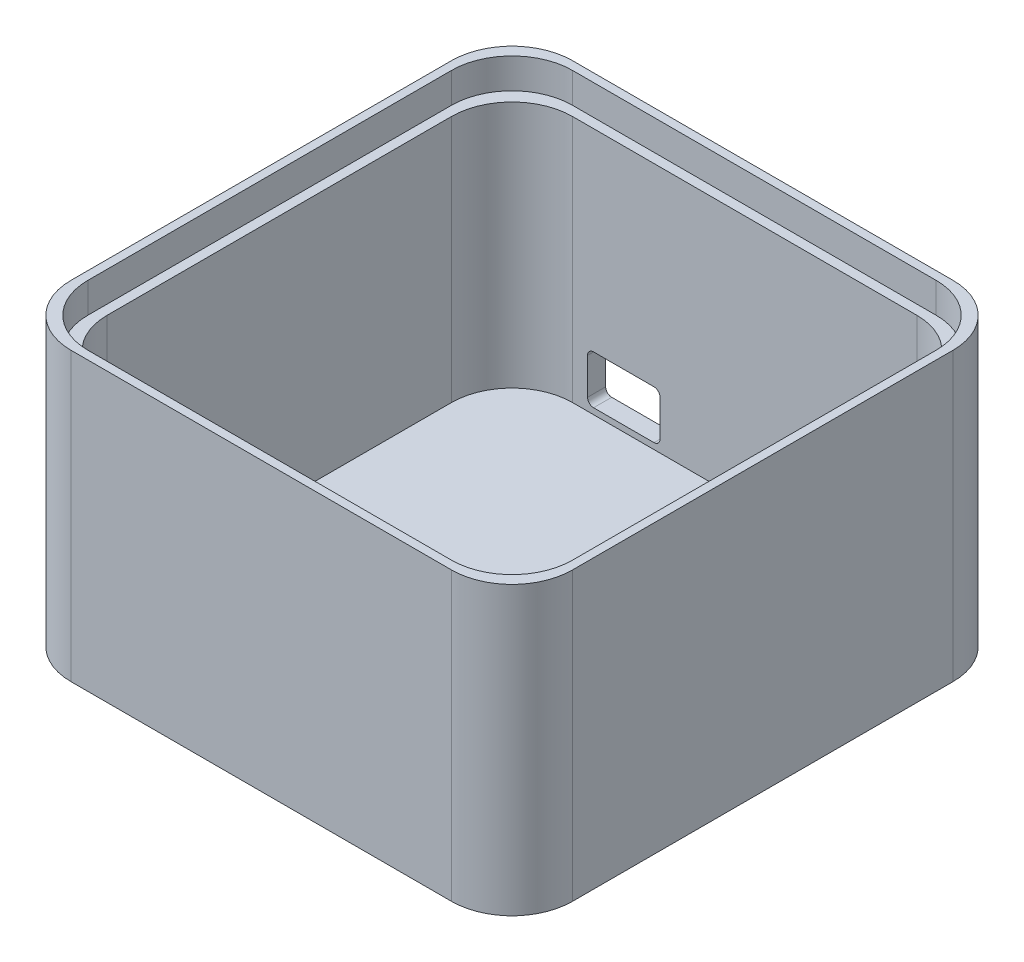
ISO-10303-21;
HEADER;
FILE_DESCRIPTION(('STEP AP214'),'2;1');
FILE_NAME('part.step','',(''),(''),'','','');
FILE_SCHEMA(('AUTOMOTIVE_DESIGN { 1 0 10303 214 1 1 1 1 }'));
ENDSEC;
DATA;
#1=APPLICATION_CONTEXT('core data for automotive mechanical design processes');
#2=APPLICATION_PROTOCOL_DEFINITION('international standard','automotive_design',2000,#1);
#3=PRODUCT_CONTEXT('',#1,'mechanical');
#4=PRODUCT('Part','Part','',(#3));
#5=PRODUCT_RELATED_PRODUCT_CATEGORY('part','',(#4));
#6=PRODUCT_DEFINITION_FORMATION('','',#4);
#7=PRODUCT_DEFINITION_CONTEXT('part definition',#1,'design');
#8=PRODUCT_DEFINITION('design','',#6,#7);
#9=PRODUCT_DEFINITION_SHAPE('','',#8);
#10=(LENGTH_UNIT() NAMED_UNIT(*) SI_UNIT(.MILLI.,.METRE.));
#11=(NAMED_UNIT(*) PLANE_ANGLE_UNIT() SI_UNIT($,.RADIAN.));
#12=(NAMED_UNIT(*) SI_UNIT($,.STERADIAN.) SOLID_ANGLE_UNIT());
#13=UNCERTAINTY_MEASURE_WITH_UNIT(LENGTH_MEASURE(1.E-05),#10,'distance_accuracy_value','');
#14=(GEOMETRIC_REPRESENTATION_CONTEXT(3) GLOBAL_UNCERTAINTY_ASSIGNED_CONTEXT((#13)) GLOBAL_UNIT_ASSIGNED_CONTEXT((#10,
#11,#12)) REPRESENTATION_CONTEXT('',''));
#15=CARTESIAN_POINT('',(0.,0.,0.));
#16=DIRECTION('',(0.,0.,1.));
#17=DIRECTION('',(1.,0.,0.));
#18=AXIS2_PLACEMENT_3D('',#15,#16,#17);
#19=CARTESIAN_POINT('',(-28.4999999999999,46.,-38.5));
#20=DIRECTION('',(0.,0.,-1.));
#21=DIRECTION('',(-1.,0.,0.));
#22=AXIS2_PLACEMENT_3D('',#19,#20,#21);
#23=PLANE('',#22);
#24=CARTESIAN_POINT('',(20.,5.,-38.5));
#25=DIRECTION('',(0.,0.,-1.));
#26=DIRECTION('',(-1.,0.,0.));
#27=AXIS2_PLACEMENT_3D('',#24,#25,#26);
#28=CIRCLE('',#27,3.);
#29=CARTESIAN_POINT('',(17.,5.,-38.5));
#30=VERTEX_POINT('',#29);
#31=EDGE_CURVE('E387',#30,#30,#28,.T.);
#32=ORIENTED_EDGE('',*,*,#31,.T.);
#33=EDGE_LOOP('',(#32));
#34=FACE_BOUND('',#33,.T.);
#35=DIRECTION('',(1.,0.,0.));
#36=VECTOR('',#35,1.);
#37=CARTESIAN_POINT('',(-28.4999999999999,41.,-38.5));
#38=LINE('',#37,#36);
#39=CARTESIAN_POINT('',(-28.4999999999999,41.,-38.5));
#40=VERTEX_POINT('',#39);
#41=CARTESIAN_POINT('',(28.4999999999999,41.,-38.5));
#42=VERTEX_POINT('',#41);
#43=EDGE_CURVE('E12',#40,#42,#38,.T.);
#44=ORIENTED_EDGE('',*,*,#43,.F.);
#45=DIRECTION('',(0.,-1.,0.));
#46=VECTOR('',#45,1.);
#47=CARTESIAN_POINT('',(-28.4999999999999,46.,-38.5));
#48=LINE('',#47,#46);
#49=CARTESIAN_POINT('',(-28.4999999999999,0.,-38.5));
#50=VERTEX_POINT('',#49);
#51=EDGE_CURVE('E564',#40,#50,#48,.T.);
#52=ORIENTED_EDGE('',*,*,#51,.T.);
#53=DIRECTION('',(1.,0.,0.));
#54=VECTOR('',#53,1.);
#55=CARTESIAN_POINT('',(-28.4999999999999,0.,-38.5));
#56=LINE('',#55,#54);
#57=CARTESIAN_POINT('',(28.4999999999999,0.,-38.5));
#58=VERTEX_POINT('',#57);
#59=EDGE_CURVE('E560',#50,#58,#56,.T.);
#60=ORIENTED_EDGE('',*,*,#59,.T.);
#61=DIRECTION('',(0.,-1.,0.));
#62=VECTOR('',#61,1.);
#63=CARTESIAN_POINT('',(28.4999999999999,46.,-38.5));
#64=LINE('',#63,#62);
#65=EDGE_CURVE('E568',#42,#58,#64,.T.);
#66=ORIENTED_EDGE('',*,*,#65,.F.);
#67=EDGE_LOOP('',(#44,#52,#60,#66));
#68=FACE_BOUND('',#67,.T.);
#69=CARTESIAN_POINT('',(-15.,8.,-38.5));
#70=DIRECTION('',(0.,0.,-1.));
#71=DIRECTION('',(-1.,0.,0.));
#72=AXIS2_PLACEMENT_3D('',#69,#70,#71);
#73=CIRCLE('',#72,1.);
#74=CARTESIAN_POINT('',(-14.,7.99999999999999,-38.5));
#75=VERTEX_POINT('',#74);
#76=CARTESIAN_POINT('',(-15.,9.,-38.5));
#77=VERTEX_POINT('',#76);
#78=EDGE_CURVE('E384',#75,#77,#73,.F.);
#79=ORIENTED_EDGE('',*,*,#78,.F.);
#80=DIRECTION('',(0.,1.,0.));
#81=VECTOR('',#80,1.);
#82=CARTESIAN_POINT('',(-14.,46.,-38.5));
#83=LINE('',#82,#81);
#84=CARTESIAN_POINT('',(-14.,2.00000000000001,-38.5));
#85=VERTEX_POINT('',#84);
#86=EDGE_CURVE('E361',#85,#75,#83,.T.);
#87=ORIENTED_EDGE('',*,*,#86,.F.);
#88=CARTESIAN_POINT('',(-15.,2.,-38.5));
#89=DIRECTION('',(0.,0.,-1.));
#90=DIRECTION('',(-1.,0.,0.));
#91=AXIS2_PLACEMENT_3D('',#88,#89,#90);
#92=CIRCLE('',#91,1.);
#93=CARTESIAN_POINT('',(-15.,0.999999999999999,-38.5));
#94=VERTEX_POINT('',#93);
#95=EDGE_CURVE('E303',#94,#85,#92,.F.);
#96=ORIENTED_EDGE('',*,*,#95,.F.);
#97=DIRECTION('',(-1.,0.,0.));
#98=VECTOR('',#97,1.);
#99=CARTESIAN_POINT('',(-28.4999999999999,1.,-38.5));
#100=LINE('',#99,#98);
#101=CARTESIAN_POINT('',(-25.,0.999999999999999,-38.5));
#102=VERTEX_POINT('',#101);
#103=EDGE_CURVE('E366',#94,#102,#100,.T.);
#104=ORIENTED_EDGE('',*,*,#103,.T.);
#105=CARTESIAN_POINT('',(-25.,2.,-38.5));
#106=DIRECTION('',(0.,0.,-1.));
#107=DIRECTION('',(-1.,0.,0.));
#108=AXIS2_PLACEMENT_3D('',#105,#106,#107);
#109=CIRCLE('',#108,1.);
#110=CARTESIAN_POINT('',(-26.,2.00000000000001,-38.5));
#111=VERTEX_POINT('',#110);
#112=EDGE_CURVE('E370',#102,#111,#109,.T.);
#113=ORIENTED_EDGE('',*,*,#112,.T.);
#114=DIRECTION('',(0.,1.,0.));
#115=VECTOR('',#114,1.);
#116=CARTESIAN_POINT('',(-26.,46.,-38.5));
#117=LINE('',#116,#115);
#118=CARTESIAN_POINT('',(-26.,7.99999999999999,-38.5));
#119=VERTEX_POINT('',#118);
#120=EDGE_CURVE('E374',#111,#119,#117,.T.);
#121=ORIENTED_EDGE('',*,*,#120,.T.);
#122=CARTESIAN_POINT('',(-25.,8.,-38.5));
#123=DIRECTION('',(0.,0.,-1.));
#124=DIRECTION('',(-1.,0.,0.));
#125=AXIS2_PLACEMENT_3D('',#122,#123,#124);
#126=CIRCLE('',#125,1.);
#127=CARTESIAN_POINT('',(-25.,9.,-38.5));
#128=VERTEX_POINT('',#127);
#129=EDGE_CURVE('E378',#128,#119,#126,.F.);
#130=ORIENTED_EDGE('',*,*,#129,.F.);
#131=DIRECTION('',(-1.,0.,0.));
#132=VECTOR('',#131,1.);
#133=CARTESIAN_POINT('',(-28.4999999999999,9.,-38.5));
#134=LINE('',#133,#132);
#135=EDGE_CURVE('E381',#77,#128,#134,.T.);
#136=ORIENTED_EDGE('',*,*,#135,.F.);
#137=EDGE_LOOP('',(#79,#87,#96,#104,#113,#121,#130,#136));
#138=FACE_BOUND('',#137,.T.);
#139=ADVANCED_FACE('F88',(#34,#68,#138),#23,.F.);
#140=CARTESIAN_POINT('',(-31.4999999999999,46.,-41.5));
#141=DIRECTION('',(0.,0.,-1.));
#142=DIRECTION('',(-1.,0.,0.));
#143=AXIS2_PLACEMENT_3D('',#140,#141,#142);
#144=PLANE('',#143);
#145=CARTESIAN_POINT('',(20.,5.,-41.5));
#146=DIRECTION('',(0.,0.,-1.));
#147=DIRECTION('',(-1.,0.,0.));
#148=AXIS2_PLACEMENT_3D('',#145,#146,#147);
#149=CIRCLE('',#148,3.);
#150=CARTESIAN_POINT('',(17.,5.,-41.5));
#151=VERTEX_POINT('',#150);
#152=EDGE_CURVE('E344',#151,#151,#149,.T.);
#153=ORIENTED_EDGE('',*,*,#152,.F.);
#154=EDGE_LOOP('',(#153));
#155=FACE_BOUND('',#154,.T.);
#156=DIRECTION('',(0.,-1.,0.));
#157=VECTOR('',#156,1.);
#158=CARTESIAN_POINT('',(31.4999999999999,46.,-41.5));
#159=LINE('',#158,#157);
#160=CARTESIAN_POINT('',(31.4999999999999,46.,-41.5));
#161=VERTEX_POINT('',#160);
#162=CARTESIAN_POINT('',(31.4999999999999,-1.5,-41.5));
#163=VERTEX_POINT('',#162);
#164=EDGE_CURVE('E627',#161,#163,#159,.T.);
#165=ORIENTED_EDGE('',*,*,#164,.T.);
#166=DIRECTION('',(1.,0.,0.));
#167=VECTOR('',#166,1.);
#168=CARTESIAN_POINT('',(-31.4999999999999,-1.5,-41.5));
#169=LINE('',#168,#167);
#170=CARTESIAN_POINT('',(-31.4999999999999,-1.5,-41.5));
#171=VERTEX_POINT('',#170);
#172=EDGE_CURVE('E395',#171,#163,#169,.T.);
#173=ORIENTED_EDGE('',*,*,#172,.F.);
#174=DIRECTION('',(0.,-1.,0.));
#175=VECTOR('',#174,1.);
#176=CARTESIAN_POINT('',(-31.4999999999999,46.,-41.5));
#177=LINE('',#176,#175);
#178=CARTESIAN_POINT('',(-31.4999999999999,46.,-41.5));
#179=VERTEX_POINT('',#178);
#180=EDGE_CURVE('E624',#179,#171,#177,.T.);
#181=ORIENTED_EDGE('',*,*,#180,.F.);
#182=DIRECTION('',(1.,0.,0.));
#183=VECTOR('',#182,1.);
#184=CARTESIAN_POINT('',(-31.4999999999999,46.,-41.5));
#185=LINE('',#184,#183);
#186=EDGE_CURVE('E620',#179,#161,#185,.T.);
#187=ORIENTED_EDGE('',*,*,#186,.T.);
#188=EDGE_LOOP('',(#165,#173,#181,#187));
#189=FACE_BOUND('',#188,.T.);
#190=DIRECTION('',(0.,1.,0.));
#191=VECTOR('',#190,1.);
#192=CARTESIAN_POINT('',(-14.,0.,-41.5));
#193=LINE('',#192,#191);
#194=CARTESIAN_POINT('',(-14.,2.00000000000001,-41.5));
#195=VERTEX_POINT('',#194);
#196=CARTESIAN_POINT('',(-14.,7.99999999999999,-41.5));
#197=VERTEX_POINT('',#196);
#198=EDGE_CURVE('E310',#195,#197,#193,.T.);
#199=ORIENTED_EDGE('',*,*,#198,.T.);
#200=CARTESIAN_POINT('',(-15.,8.,-41.5));
#201=DIRECTION('',(0.,0.,-1.));
#202=DIRECTION('',(-1.,0.,0.));
#203=AXIS2_PLACEMENT_3D('',#200,#201,#202);
#204=CIRCLE('',#203,1.);
#205=CARTESIAN_POINT('',(-15.,9.,-41.5));
#206=VERTEX_POINT('',#205);
#207=EDGE_CURVE('E112',#197,#206,#204,.F.);
#208=ORIENTED_EDGE('',*,*,#207,.T.);
#209=DIRECTION('',(-1.,0.,0.));
#210=VECTOR('',#209,1.);
#211=CARTESIAN_POINT('',(0.,9.,-41.5));
#212=LINE('',#211,#210);
#213=CARTESIAN_POINT('',(-25.,9.,-41.5));
#214=VERTEX_POINT('',#213);
#215=EDGE_CURVE('E337',#206,#214,#212,.T.);
#216=ORIENTED_EDGE('',*,*,#215,.T.);
#217=CARTESIAN_POINT('',(-25.,8.,-41.5));
#218=DIRECTION('',(0.,0.,-1.));
#219=DIRECTION('',(-1.,0.,0.));
#220=AXIS2_PLACEMENT_3D('',#217,#218,#219);
#221=CIRCLE('',#220,1.);
#222=CARTESIAN_POINT('',(-26.,7.99999999999999,-41.5));
#223=VERTEX_POINT('',#222);
#224=EDGE_CURVE('E333',#214,#223,#221,.F.);
#225=ORIENTED_EDGE('',*,*,#224,.T.);
#226=DIRECTION('',(0.,1.,0.));
#227=VECTOR('',#226,1.);
#228=CARTESIAN_POINT('',(-26.,0.,-41.5));
#229=LINE('',#228,#227);
#230=CARTESIAN_POINT('',(-26.,2.00000000000001,-41.5));
#231=VERTEX_POINT('',#230);
#232=EDGE_CURVE('E329',#231,#223,#229,.T.);
#233=ORIENTED_EDGE('',*,*,#232,.F.);
#234=CARTESIAN_POINT('',(-25.,2.,-41.5));
#235=DIRECTION('',(0.,0.,-1.));
#236=DIRECTION('',(-1.,0.,0.));
#237=AXIS2_PLACEMENT_3D('',#234,#235,#236);
#238=CIRCLE('',#237,1.);
#239=CARTESIAN_POINT('',(-25.,0.999999999999999,-41.5));
#240=VERTEX_POINT('',#239);
#241=EDGE_CURVE('E322',#240,#231,#238,.T.);
#242=ORIENTED_EDGE('',*,*,#241,.F.);
#243=DIRECTION('',(-1.,0.,0.));
#244=VECTOR('',#243,1.);
#245=CARTESIAN_POINT('',(0.,0.999999999999999,-41.5));
#246=LINE('',#245,#244);
#247=CARTESIAN_POINT('',(-15.,0.999999999999999,-41.5));
#248=VERTEX_POINT('',#247);
#249=EDGE_CURVE('E318',#248,#240,#246,.T.);
#250=ORIENTED_EDGE('',*,*,#249,.F.);
#251=CARTESIAN_POINT('',(-15.,2.,-41.5));
#252=DIRECTION('',(0.,0.,-1.));
#253=DIRECTION('',(-1.,0.,0.));
#254=AXIS2_PLACEMENT_3D('',#251,#252,#253);
#255=CIRCLE('',#254,1.);
#256=EDGE_CURVE('E300',#248,#195,#255,.F.);
#257=ORIENTED_EDGE('',*,*,#256,.T.);
#258=EDGE_LOOP('',(#199,#208,#216,#225,#233,#242,#250,#257));
#259=FACE_BOUND('',#258,.T.);
#260=ADVANCED_FACE('F315',(#155,#189,#259),#144,.T.);
#261=CARTESIAN_POINT('',(-28.5,46.,-28.5));
#262=DIRECTION('',(0.,-1.,0.));
#263=DIRECTION('',(0.,0.,-1.));
#264=AXIS2_PLACEMENT_3D('',#261,#262,#263);
#265=CYLINDRICAL_SURFACE('',#264,10.);
#266=ORIENTED_EDGE('',*,*,#51,.F.);
#267=CARTESIAN_POINT('',(-28.5,41.,-28.5));
#268=DIRECTION('',(0.,1.,0.));
#269=DIRECTION('',(0.,0.,1.));
#270=AXIS2_PLACEMENT_3D('',#267,#268,#269);
#271=CIRCLE('',#270,10.);
#272=CARTESIAN_POINT('',(-38.5,41.,-28.4999999999999));
#273=VERTEX_POINT('',#272);
#274=EDGE_CURVE('E533',#40,#273,#271,.T.);
#275=ORIENTED_EDGE('',*,*,#274,.T.);
#276=DIRECTION('',(0.,-1.,0.));
#277=VECTOR('',#276,1.);
#278=CARTESIAN_POINT('',(-38.5,46.,-28.4999999999999));
#279=LINE('',#278,#277);
#280=CARTESIAN_POINT('',(-38.5,0.,-28.4999999999999));
#281=VERTEX_POINT('',#280);
#282=EDGE_CURVE('E592',#273,#281,#279,.T.);
#283=ORIENTED_EDGE('',*,*,#282,.T.);
#284=CARTESIAN_POINT('',(-28.5,0.,-28.5));
#285=DIRECTION('',(0.,1.,0.));
#286=DIRECTION('',(0.,0.,1.));
#287=AXIS2_PLACEMENT_3D('',#284,#285,#286);
#288=CIRCLE('',#287,10.);
#289=EDGE_CURVE('E537',#50,#281,#288,.T.);
#290=ORIENTED_EDGE('',*,*,#289,.F.);
#291=EDGE_LOOP('',(#266,#275,#283,#290));
#292=FACE_BOUND('',#291,.T.);
#293=ADVANCED_FACE('F696',(#292),#265,.F.);
#294=CARTESIAN_POINT('',(-38.5,46.,-28.4999999999999));
#295=DIRECTION('',(1.,0.,0.));
#296=DIRECTION('',(0.,0.,-1.));
#297=AXIS2_PLACEMENT_3D('',#294,#295,#296);
#298=PLANE('',#297);
#299=ORIENTED_EDGE('',*,*,#282,.F.);
#300=DIRECTION('',(0.,0.,1.));
#301=VECTOR('',#300,1.);
#302=CARTESIAN_POINT('',(-38.5,41.,-28.4999999999999));
#303=LINE('',#302,#301);
#304=CARTESIAN_POINT('',(-38.5,41.,28.5));
#305=VERTEX_POINT('',#304);
#306=EDGE_CURVE('E529',#273,#305,#303,.T.);
#307=ORIENTED_EDGE('',*,*,#306,.T.);
#308=DIRECTION('',(0.,-1.,0.));
#309=VECTOR('',#308,1.);
#310=CARTESIAN_POINT('',(-38.5,46.,28.5));
#311=LINE('',#310,#309);
#312=CARTESIAN_POINT('',(-38.5,0.,28.5));
#313=VERTEX_POINT('',#312);
#314=EDGE_CURVE('E588',#305,#313,#311,.T.);
#315=ORIENTED_EDGE('',*,*,#314,.T.);
#316=DIRECTION('',(0.,0.,1.));
#317=VECTOR('',#316,1.);
#318=CARTESIAN_POINT('',(-38.5,0.,-28.4999999999999));
#319=LINE('',#318,#317);
#320=EDGE_CURVE('E540',#281,#313,#319,.T.);
#321=ORIENTED_EDGE('',*,*,#320,.F.);
#322=EDGE_LOOP('',(#299,#307,#315,#321));
#323=FACE_BOUND('',#322,.T.);
#324=ADVANCED_FACE('F723',(#323),#298,.T.);
#325=CARTESIAN_POINT('',(-28.5,46.,28.5));
#326=DIRECTION('',(0.,-1.,0.));
#327=DIRECTION('',(0.,0.,-1.));
#328=AXIS2_PLACEMENT_3D('',#325,#326,#327);
#329=CYLINDRICAL_SURFACE('',#328,10.);
#330=ORIENTED_EDGE('',*,*,#314,.F.);
#331=CARTESIAN_POINT('',(-28.5,41.,28.5));
#332=DIRECTION('',(0.,1.,0.));
#333=DIRECTION('',(0.,0.,1.));
#334=AXIS2_PLACEMENT_3D('',#331,#332,#333);
#335=CIRCLE('',#334,10.);
#336=CARTESIAN_POINT('',(-28.4999999999999,41.,38.5));
#337=VERTEX_POINT('',#336);
#338=EDGE_CURVE('E525',#305,#337,#335,.T.);
#339=ORIENTED_EDGE('',*,*,#338,.T.);
#340=DIRECTION('',(0.,-1.,0.));
#341=VECTOR('',#340,1.);
#342=CARTESIAN_POINT('',(-28.4999999999999,46.,38.5));
#343=LINE('',#342,#341);
#344=CARTESIAN_POINT('',(-28.4999999999999,0.,38.5));
#345=VERTEX_POINT('',#344);
#346=EDGE_CURVE('E584',#337,#345,#343,.T.);
#347=ORIENTED_EDGE('',*,*,#346,.T.);
#348=CARTESIAN_POINT('',(-28.5,0.,28.5));
#349=DIRECTION('',(0.,1.,0.));
#350=DIRECTION('',(0.,0.,1.));
#351=AXIS2_PLACEMENT_3D('',#348,#349,#350);
#352=CIRCLE('',#351,10.);
#353=EDGE_CURVE('E543',#313,#345,#352,.T.);
#354=ORIENTED_EDGE('',*,*,#353,.F.);
#355=EDGE_LOOP('',(#330,#339,#347,#354));
#356=FACE_BOUND('',#355,.T.);
#357=ADVANCED_FACE('F719',(#356),#329,.F.);
#358=CARTESIAN_POINT('',(-28.4999999999999,46.,38.5));
#359=DIRECTION('',(0.,0.,-1.));
#360=DIRECTION('',(-1.,0.,0.));
#361=AXIS2_PLACEMENT_3D('',#358,#359,#360);
#362=PLANE('',#361);
#363=ORIENTED_EDGE('',*,*,#346,.F.);
#364=DIRECTION('',(1.,0.,0.));
#365=VECTOR('',#364,1.);
#366=CARTESIAN_POINT('',(-28.4999999999999,41.,38.5));
#367=LINE('',#366,#365);
#368=CARTESIAN_POINT('',(28.5,41.,38.5));
#369=VERTEX_POINT('',#368);
#370=EDGE_CURVE('E521',#337,#369,#367,.T.);
#371=ORIENTED_EDGE('',*,*,#370,.T.);
#372=DIRECTION('',(0.,-1.,0.));
#373=VECTOR('',#372,1.);
#374=CARTESIAN_POINT('',(28.4999999999999,46.,38.5));
#375=LINE('',#374,#373);
#376=CARTESIAN_POINT('',(28.4999999999999,0.,38.5));
#377=VERTEX_POINT('',#376);
#378=EDGE_CURVE('E580',#369,#377,#375,.T.);
#379=ORIENTED_EDGE('',*,*,#378,.T.);
#380=DIRECTION('',(1.,0.,0.));
#381=VECTOR('',#380,1.);
#382=CARTESIAN_POINT('',(-28.4999999999999,0.,38.5));
#383=LINE('',#382,#381);
#384=EDGE_CURVE('E546',#345,#377,#383,.T.);
#385=ORIENTED_EDGE('',*,*,#384,.F.);
#386=EDGE_LOOP('',(#363,#371,#379,#385));
#387=FACE_BOUND('',#386,.T.);
#388=ADVANCED_FACE('F715',(#387),#362,.T.);
#389=CARTESIAN_POINT('',(28.5,46.,28.5));
#390=DIRECTION('',(0.,-1.,0.));
#391=DIRECTION('',(0.,0.,-1.));
#392=AXIS2_PLACEMENT_3D('',#389,#390,#391);
#393=CYLINDRICAL_SURFACE('',#392,10.);
#394=ORIENTED_EDGE('',*,*,#378,.F.);
#395=CARTESIAN_POINT('',(28.5,41.,28.5));
#396=DIRECTION('',(0.,1.,0.));
#397=DIRECTION('',(0.,0.,1.));
#398=AXIS2_PLACEMENT_3D('',#395,#396,#397);
#399=CIRCLE('',#398,10.);
#400=CARTESIAN_POINT('',(38.5,41.,28.5));
#401=VERTEX_POINT('',#400);
#402=EDGE_CURVE('E517',#369,#401,#399,.T.);
#403=ORIENTED_EDGE('',*,*,#402,.T.);
#404=DIRECTION('',(0.,-1.,0.));
#405=VECTOR('',#404,1.);
#406=CARTESIAN_POINT('',(38.5,46.,28.5));
#407=LINE('',#406,#405);
#408=CARTESIAN_POINT('',(38.5,0.,28.5));
#409=VERTEX_POINT('',#408);
#410=EDGE_CURVE('E576',#401,#409,#407,.T.);
#411=ORIENTED_EDGE('',*,*,#410,.T.);
#412=CARTESIAN_POINT('',(28.5,0.,28.5));
#413=DIRECTION('',(0.,1.,0.));
#414=DIRECTION('',(0.,0.,1.));
#415=AXIS2_PLACEMENT_3D('',#412,#413,#414);
#416=CIRCLE('',#415,10.);
#417=EDGE_CURVE('E549',#377,#409,#416,.T.);
#418=ORIENTED_EDGE('',*,*,#417,.F.);
#419=EDGE_LOOP('',(#394,#403,#411,#418));
#420=FACE_BOUND('',#419,.T.);
#421=ADVANCED_FACE('F711',(#420),#393,.F.);
#422=CARTESIAN_POINT('',(38.5,46.,-28.4999999999999));
#423=DIRECTION('',(1.,0.,0.));
#424=DIRECTION('',(0.,0.,-1.));
#425=AXIS2_PLACEMENT_3D('',#422,#423,#424);
#426=PLANE('',#425);
#427=DIRECTION('',(0.,0.,1.));
#428=VECTOR('',#427,1.);
#429=CARTESIAN_POINT('',(38.5,41.,-28.4999999999999));
#430=LINE('',#429,#428);
#431=CARTESIAN_POINT('',(38.5,41.,-28.4999999999999));
#432=VERTEX_POINT('',#431);
#433=EDGE_CURVE('E514',#432,#401,#430,.T.);
#434=ORIENTED_EDGE('',*,*,#433,.F.);
#435=DIRECTION('',(0.,-1.,0.));
#436=VECTOR('',#435,1.);
#437=CARTESIAN_POINT('',(38.5,46.,-28.4999999999999));
#438=LINE('',#437,#436);
#439=CARTESIAN_POINT('',(38.5,0.,-28.4999999999999));
#440=VERTEX_POINT('',#439);
#441=EDGE_CURVE('E572',#432,#440,#438,.T.);
#442=ORIENTED_EDGE('',*,*,#441,.T.);
#443=DIRECTION('',(0.,0.,1.));
#444=VECTOR('',#443,1.);
#445=CARTESIAN_POINT('',(38.5,0.,-28.4999999999999));
#446=LINE('',#445,#444);
#447=EDGE_CURVE('E552',#440,#409,#446,.T.);
#448=ORIENTED_EDGE('',*,*,#447,.T.);
#449=ORIENTED_EDGE('',*,*,#410,.F.);
#450=EDGE_LOOP('',(#434,#442,#448,#449));
#451=FACE_BOUND('',#450,.T.);
#452=ADVANCED_FACE('F707',(#451),#426,.F.);
#453=CARTESIAN_POINT('',(28.5,46.,-28.5));
#454=DIRECTION('',(0.,-1.,0.));
#455=DIRECTION('',(0.,0.,-1.));
#456=AXIS2_PLACEMENT_3D('',#453,#454,#455);
#457=CYLINDRICAL_SURFACE('',#456,10.);
#458=CARTESIAN_POINT('',(28.5,41.,-28.5));
#459=DIRECTION('',(0.,1.,0.));
#460=DIRECTION('',(0.,0.,1.));
#461=AXIS2_PLACEMENT_3D('',#458,#459,#460);
#462=CIRCLE('',#461,10.);
#463=EDGE_CURVE('E490',#42,#432,#462,.F.);
#464=ORIENTED_EDGE('',*,*,#463,.F.);
#465=ORIENTED_EDGE('',*,*,#65,.T.);
#466=CARTESIAN_POINT('',(28.5,0.,-28.5));
#467=DIRECTION('',(0.,-1.,0.));
#468=DIRECTION('',(0.,0.,-1.));
#469=AXIS2_PLACEMENT_3D('',#466,#467,#468);
#470=CIRCLE('',#469,10.);
#471=EDGE_CURVE('E556',#58,#440,#470,.T.);
#472=ORIENTED_EDGE('',*,*,#471,.T.);
#473=ORIENTED_EDGE('',*,*,#441,.F.);
#474=EDGE_LOOP('',(#464,#465,#472,#473));
#475=FACE_BOUND('',#474,.T.);
#476=ADVANCED_FACE('F704',(#475),#457,.F.);
#477=CARTESIAN_POINT('',(-31.5,46.,-31.5));
#478=DIRECTION('',(0.,1.,0.));
#479=DIRECTION('',(0.,0.,1.));
#480=AXIS2_PLACEMENT_3D('',#477,#478,#479);
#481=PLANE('',#480);
#482=CARTESIAN_POINT('',(-30.1,46.,30.1));
#483=DIRECTION('',(0.,1.,0.));
#484=DIRECTION('',(0.,0.,1.));
#485=AXIS2_PLACEMENT_3D('',#482,#483,#484);
#486=CIRCLE('',#485,10.);
#487=CARTESIAN_POINT('',(-40.1,46.,30.0999999999999));
#488=VERTEX_POINT('',#487);
#489=CARTESIAN_POINT('',(-30.0999999999999,46.,40.1));
#490=VERTEX_POINT('',#489);
#491=EDGE_CURVE('E423',#488,#490,#486,.T.);
#492=ORIENTED_EDGE('',*,*,#491,.F.);
#493=DIRECTION('',(0.,0.,1.));
#494=VECTOR('',#493,1.);
#495=CARTESIAN_POINT('',(-40.1,46.,-30.0999999999999));
#496=LINE('',#495,#494);
#497=CARTESIAN_POINT('',(-40.1,46.,-30.0999999999999));
#498=VERTEX_POINT('',#497);
#499=EDGE_CURVE('E429',#498,#488,#496,.T.);
#500=ORIENTED_EDGE('',*,*,#499,.F.);
#501=CARTESIAN_POINT('',(-30.1,46.,-30.1));
#502=DIRECTION('',(0.,1.,0.));
#503=DIRECTION('',(0.,0.,1.));
#504=AXIS2_PLACEMENT_3D('',#501,#502,#503);
#505=CIRCLE('',#504,10.);
#506=CARTESIAN_POINT('',(-30.0999999999999,46.,-40.1));
#507=VERTEX_POINT('',#506);
#508=EDGE_CURVE('E480',#507,#498,#505,.T.);
#509=ORIENTED_EDGE('',*,*,#508,.F.);
#510=DIRECTION('',(-1.,0.,0.));
#511=VECTOR('',#510,1.);
#512=CARTESIAN_POINT('',(-30.0999999999999,46.,-40.1));
#513=LINE('',#512,#511);
#514=CARTESIAN_POINT('',(30.0999999999999,46.,-40.1));
#515=VERTEX_POINT('',#514);
#516=EDGE_CURVE('E476',#515,#507,#513,.T.);
#517=ORIENTED_EDGE('',*,*,#516,.F.);
#518=CARTESIAN_POINT('',(30.1,46.,-30.1));
#519=DIRECTION('',(0.,1.,0.));
#520=DIRECTION('',(0.,0.,-1.));
#521=AXIS2_PLACEMENT_3D('',#518,#519,#520);
#522=CIRCLE('',#521,10.);
#523=CARTESIAN_POINT('',(40.1,46.,-30.0999999999999));
#524=VERTEX_POINT('',#523);
#525=EDGE_CURVE('E472',#524,#515,#522,.T.);
#526=ORIENTED_EDGE('',*,*,#525,.F.);
#527=DIRECTION('',(0.,0.,-1.));
#528=VECTOR('',#527,1.);
#529=CARTESIAN_POINT('',(40.1,46.,-30.0999999999999));
#530=LINE('',#529,#528);
#531=CARTESIAN_POINT('',(40.1,46.,30.0999999999999));
#532=VERTEX_POINT('',#531);
#533=EDGE_CURVE('E468',#532,#524,#530,.T.);
#534=ORIENTED_EDGE('',*,*,#533,.F.);
#535=CARTESIAN_POINT('',(30.1,46.,30.1));
#536=DIRECTION('',(0.,1.,0.));
#537=DIRECTION('',(0.,0.,1.));
#538=AXIS2_PLACEMENT_3D('',#535,#536,#537);
#539=CIRCLE('',#538,10.);
#540=CARTESIAN_POINT('',(30.0999999999999,46.,40.1));
#541=VERTEX_POINT('',#540);
#542=EDGE_CURVE('E464',#541,#532,#539,.T.);
#543=ORIENTED_EDGE('',*,*,#542,.F.);
#544=DIRECTION('',(1.,0.,0.));
#545=VECTOR('',#544,1.);
#546=CARTESIAN_POINT('',(-30.0999999999999,46.,40.1));
#547=LINE('',#546,#545);
#548=EDGE_CURVE('E460',#490,#541,#547,.T.);
#549=ORIENTED_EDGE('',*,*,#548,.F.);
#550=EDGE_LOOP('',(#492,#500,#509,#517,#526,#534,#543,#549));
#551=FACE_BOUND('',#550,.T.);
#552=CARTESIAN_POINT('',(-31.5,46.,-31.5));
#553=DIRECTION('',(0.,1.,0.));
#554=DIRECTION('',(0.,0.,1.));
#555=AXIS2_PLACEMENT_3D('',#552,#553,#554);
#556=CIRCLE('',#555,10.);
#557=CARTESIAN_POINT('',(-41.5,46.,-31.4999999999999));
#558=VERTEX_POINT('',#557);
#559=EDGE_CURVE('E596',#179,#558,#556,.T.);
#560=ORIENTED_EDGE('',*,*,#559,.T.);
#561=DIRECTION('',(0.,0.,1.));
#562=VECTOR('',#561,1.);
#563=CARTESIAN_POINT('',(-41.5,46.,-31.4999999999999));
#564=LINE('',#563,#562);
#565=CARTESIAN_POINT('',(-41.5,46.,31.4999999999999));
#566=VERTEX_POINT('',#565);
#567=EDGE_CURVE('E600',#558,#566,#564,.T.);
#568=ORIENTED_EDGE('',*,*,#567,.T.);
#569=CARTESIAN_POINT('',(-31.5,46.,31.5));
#570=DIRECTION('',(0.,1.,0.));
#571=DIRECTION('',(0.,0.,1.));
#572=AXIS2_PLACEMENT_3D('',#569,#570,#571);
#573=CIRCLE('',#572,10.);
#574=CARTESIAN_POINT('',(-31.4999999999999,46.,41.5));
#575=VERTEX_POINT('',#574);
#576=EDGE_CURVE('E603',#566,#575,#573,.T.);
#577=ORIENTED_EDGE('',*,*,#576,.T.);
#578=DIRECTION('',(1.,0.,0.));
#579=VECTOR('',#578,1.);
#580=CARTESIAN_POINT('',(-31.4999999999999,46.,41.5));
#581=LINE('',#580,#579);
#582=CARTESIAN_POINT('',(31.4999999999999,46.,41.5));
#583=VERTEX_POINT('',#582);
#584=EDGE_CURVE('E606',#575,#583,#581,.T.);
#585=ORIENTED_EDGE('',*,*,#584,.T.);
#586=CARTESIAN_POINT('',(31.5,46.,31.5));
#587=DIRECTION('',(0.,1.,0.));
#588=DIRECTION('',(0.,0.,1.));
#589=AXIS2_PLACEMENT_3D('',#586,#587,#588);
#590=CIRCLE('',#589,10.);
#591=CARTESIAN_POINT('',(41.5,46.,31.4999999999999));
#592=VERTEX_POINT('',#591);
#593=EDGE_CURVE('E609',#583,#592,#590,.T.);
#594=ORIENTED_EDGE('',*,*,#593,.T.);
#595=DIRECTION('',(0.,0.,1.));
#596=VECTOR('',#595,1.);
#597=CARTESIAN_POINT('',(41.5,46.,-31.4999999999999));
#598=LINE('',#597,#596);
#599=CARTESIAN_POINT('',(41.5,46.,-31.4999999999999));
#600=VERTEX_POINT('',#599);
#601=EDGE_CURVE('E612',#600,#592,#598,.T.);
#602=ORIENTED_EDGE('',*,*,#601,.F.);
#603=CARTESIAN_POINT('',(31.5,46.,-31.5));
#604=DIRECTION('',(0.,-1.,0.));
#605=DIRECTION('',(0.,0.,-1.));
#606=AXIS2_PLACEMENT_3D('',#603,#604,#605);
#607=CIRCLE('',#606,10.);
#608=EDGE_CURVE('E616',#161,#600,#607,.T.);
#609=ORIENTED_EDGE('',*,*,#608,.F.);
#610=ORIENTED_EDGE('',*,*,#186,.F.);
#611=EDGE_LOOP('',(#560,#568,#577,#585,#594,#602,#609,#610));
#612=FACE_BOUND('',#611,.T.);
#613=ADVANCED_FACE('F668',(#551,#612),#481,.T.);
#614=CARTESIAN_POINT('',(-31.5,46.,-31.5));
#615=DIRECTION('',(0.,-1.,0.));
#616=DIRECTION('',(0.,0.,-1.));
#617=AXIS2_PLACEMENT_3D('',#614,#615,#616);
#618=CYLINDRICAL_SURFACE('',#617,10.);
#619=ORIENTED_EDGE('',*,*,#180,.T.);
#620=CARTESIAN_POINT('',(-31.5,-1.5,-31.5));
#621=DIRECTION('',(0.,-1.,0.));
#622=DIRECTION('',(0.,0.,-1.));
#623=AXIS2_PLACEMENT_3D('',#620,#621,#622);
#624=CIRCLE('',#623,10.);
#625=CARTESIAN_POINT('',(-41.5,-1.5,-31.4999999999999));
#626=VERTEX_POINT('',#625);
#627=EDGE_CURVE('E391',#626,#171,#624,.T.);
#628=ORIENTED_EDGE('',*,*,#627,.F.);
#629=DIRECTION('',(0.,-1.,0.));
#630=VECTOR('',#629,1.);
#631=CARTESIAN_POINT('',(-41.5,46.,-31.4999999999999));
#632=LINE('',#631,#630);
#633=EDGE_CURVE('E97',#558,#626,#632,.T.);
#634=ORIENTED_EDGE('',*,*,#633,.F.);
#635=ORIENTED_EDGE('',*,*,#559,.F.);
#636=EDGE_LOOP('',(#619,#628,#634,#635));
#637=FACE_BOUND('',#636,.T.);
#638=ADVANCED_FACE('F90',(#637),#618,.T.);
#639=CARTESIAN_POINT('',(-41.5,46.,-31.4999999999999));
#640=DIRECTION('',(1.,0.,0.));
#641=DIRECTION('',(0.,0.,-1.));
#642=AXIS2_PLACEMENT_3D('',#639,#640,#641);
#643=PLANE('',#642);
#644=ORIENTED_EDGE('',*,*,#633,.T.);
#645=DIRECTION('',(0.,0.,-1.));
#646=VECTOR('',#645,1.);
#647=CARTESIAN_POINT('',(-41.5,-1.5,31.4999999999999));
#648=LINE('',#647,#646);
#649=CARTESIAN_POINT('',(-41.5,-1.5,31.4999999999999));
#650=VERTEX_POINT('',#649);
#651=EDGE_CURVE('E419',#650,#626,#648,.T.);
#652=ORIENTED_EDGE('',*,*,#651,.F.);
#653=DIRECTION('',(0.,-1.,0.));
#654=VECTOR('',#653,1.);
#655=CARTESIAN_POINT('',(-41.5,46.,31.4999999999999));
#656=LINE('',#655,#654);
#657=EDGE_CURVE('E642',#566,#650,#656,.T.);
#658=ORIENTED_EDGE('',*,*,#657,.F.);
#659=ORIENTED_EDGE('',*,*,#567,.F.);
#660=EDGE_LOOP('',(#644,#652,#658,#659));
#661=FACE_BOUND('',#660,.T.);
#662=ADVANCED_FACE('F648',(#661),#643,.F.);
#663=CARTESIAN_POINT('',(-31.5,46.,31.5));
#664=DIRECTION('',(0.,-1.,0.));
#665=DIRECTION('',(0.,0.,-1.));
#666=AXIS2_PLACEMENT_3D('',#663,#664,#665);
#667=CYLINDRICAL_SURFACE('',#666,10.);
#668=ORIENTED_EDGE('',*,*,#657,.T.);
#669=CARTESIAN_POINT('',(-31.5,-1.5,31.5));
#670=DIRECTION('',(0.,-1.,0.));
#671=DIRECTION('',(0.,0.,-1.));
#672=AXIS2_PLACEMENT_3D('',#669,#670,#671);
#673=CIRCLE('',#672,10.);
#674=CARTESIAN_POINT('',(-31.4999999999999,-1.5,41.5));
#675=VERTEX_POINT('',#674);
#676=EDGE_CURVE('E415',#675,#650,#673,.T.);
#677=ORIENTED_EDGE('',*,*,#676,.F.);
#678=DIRECTION('',(0.,-1.,0.));
#679=VECTOR('',#678,1.);
#680=CARTESIAN_POINT('',(-31.4999999999999,46.,41.5));
#681=LINE('',#680,#679);
#682=EDGE_CURVE('E639',#575,#675,#681,.T.);
#683=ORIENTED_EDGE('',*,*,#682,.F.);
#684=ORIENTED_EDGE('',*,*,#576,.F.);
#685=EDGE_LOOP('',(#668,#677,#683,#684));
#686=FACE_BOUND('',#685,.T.);
#687=ADVANCED_FACE('F682',(#686),#667,.T.);
#688=CARTESIAN_POINT('',(-31.4999999999999,46.,41.5));
#689=DIRECTION('',(0.,0.,-1.));
#690=DIRECTION('',(-1.,0.,0.));
#691=AXIS2_PLACEMENT_3D('',#688,#689,#690);
#692=PLANE('',#691);
#693=ORIENTED_EDGE('',*,*,#682,.T.);
#694=DIRECTION('',(-1.,0.,0.));
#695=VECTOR('',#694,1.);
#696=CARTESIAN_POINT('',(-31.4999999999999,-1.5,41.5));
#697=LINE('',#696,#695);
#698=CARTESIAN_POINT('',(31.4999999999999,-1.5,41.5));
#699=VERTEX_POINT('',#698);
#700=EDGE_CURVE('E411',#699,#675,#697,.T.);
#701=ORIENTED_EDGE('',*,*,#700,.F.);
#702=DIRECTION('',(0.,-1.,0.));
#703=VECTOR('',#702,1.);
#704=CARTESIAN_POINT('',(31.4999999999999,46.,41.5));
#705=LINE('',#704,#703);
#706=EDGE_CURVE('E636',#583,#699,#705,.T.);
#707=ORIENTED_EDGE('',*,*,#706,.F.);
#708=ORIENTED_EDGE('',*,*,#584,.F.);
#709=EDGE_LOOP('',(#693,#701,#707,#708));
#710=FACE_BOUND('',#709,.T.);
#711=ADVANCED_FACE('F678',(#710),#692,.F.);
#712=CARTESIAN_POINT('',(31.5,46.,31.5));
#713=DIRECTION('',(0.,-1.,0.));
#714=DIRECTION('',(0.,0.,-1.));
#715=AXIS2_PLACEMENT_3D('',#712,#713,#714);
#716=CYLINDRICAL_SURFACE('',#715,10.);
#717=ORIENTED_EDGE('',*,*,#706,.T.);
#718=CARTESIAN_POINT('',(31.5,-1.5,31.5));
#719=DIRECTION('',(0.,-1.,0.));
#720=DIRECTION('',(0.,0.,1.));
#721=AXIS2_PLACEMENT_3D('',#718,#719,#720);
#722=CIRCLE('',#721,10.);
#723=CARTESIAN_POINT('',(41.5,-1.5,31.4999999999999));
#724=VERTEX_POINT('',#723);
#725=EDGE_CURVE('E407',#724,#699,#722,.T.);
#726=ORIENTED_EDGE('',*,*,#725,.F.);
#727=DIRECTION('',(0.,-1.,0.));
#728=VECTOR('',#727,1.);
#729=CARTESIAN_POINT('',(41.5,46.,31.4999999999999));
#730=LINE('',#729,#728);
#731=EDGE_CURVE('E633',#592,#724,#730,.T.);
#732=ORIENTED_EDGE('',*,*,#731,.F.);
#733=ORIENTED_EDGE('',*,*,#593,.F.);
#734=EDGE_LOOP('',(#717,#726,#732,#733));
#735=FACE_BOUND('',#734,.T.);
#736=ADVANCED_FACE('F675',(#735),#716,.T.);
#737=CARTESIAN_POINT('',(41.5,46.,-31.4999999999999));
#738=DIRECTION('',(1.,0.,0.));
#739=DIRECTION('',(0.,0.,-1.));
#740=AXIS2_PLACEMENT_3D('',#737,#738,#739);
#741=PLANE('',#740);
#742=ORIENTED_EDGE('',*,*,#731,.T.);
#743=DIRECTION('',(0.,0.,1.));
#744=VECTOR('',#743,1.);
#745=CARTESIAN_POINT('',(41.5,-1.5,31.4999999999999));
#746=LINE('',#745,#744);
#747=CARTESIAN_POINT('',(41.5,-1.5,-31.4999999999999));
#748=VERTEX_POINT('',#747);
#749=EDGE_CURVE('E403',#748,#724,#746,.T.);
#750=ORIENTED_EDGE('',*,*,#749,.F.);
#751=DIRECTION('',(0.,-1.,0.));
#752=VECTOR('',#751,1.);
#753=CARTESIAN_POINT('',(41.5,46.,-31.4999999999999));
#754=LINE('',#753,#752);
#755=EDGE_CURVE('E630',#600,#748,#754,.T.);
#756=ORIENTED_EDGE('',*,*,#755,.F.);
#757=ORIENTED_EDGE('',*,*,#601,.T.);
#758=EDGE_LOOP('',(#742,#750,#756,#757));
#759=FACE_BOUND('',#758,.T.);
#760=ADVANCED_FACE('F666',(#759),#741,.T.);
#761=CARTESIAN_POINT('',(31.5,46.,-31.5));
#762=DIRECTION('',(0.,-1.,0.));
#763=DIRECTION('',(0.,0.,-1.));
#764=AXIS2_PLACEMENT_3D('',#761,#762,#763);
#765=CYLINDRICAL_SURFACE('',#764,10.);
#766=ORIENTED_EDGE('',*,*,#755,.T.);
#767=CARTESIAN_POINT('',(31.5,-1.5,-31.5));
#768=DIRECTION('',(0.,-1.,0.));
#769=DIRECTION('',(0.,0.,-1.));
#770=AXIS2_PLACEMENT_3D('',#767,#768,#769);
#771=CIRCLE('',#770,10.);
#772=EDGE_CURVE('E399',#163,#748,#771,.T.);
#773=ORIENTED_EDGE('',*,*,#772,.F.);
#774=ORIENTED_EDGE('',*,*,#164,.F.);
#775=ORIENTED_EDGE('',*,*,#608,.T.);
#776=EDGE_LOOP('',(#766,#773,#774,#775));
#777=FACE_BOUND('',#776,.T.);
#778=ADVANCED_FACE('F662',(#777),#765,.T.);
#779=CARTESIAN_POINT('',(-30.1,41.,30.1));
#780=DIRECTION('',(0.,1.,0.));
#781=DIRECTION('',(0.,0.,1.));
#782=AXIS2_PLACEMENT_3D('',#779,#780,#781);
#783=CYLINDRICAL_SURFACE('',#782,10.);
#784=ORIENTED_EDGE('',*,*,#491,.T.);
#785=DIRECTION('',(0.,1.,0.));
#786=VECTOR('',#785,1.);
#787=CARTESIAN_POINT('',(-30.0999999999999,41.,40.1));
#788=LINE('',#787,#786);
#789=CARTESIAN_POINT('',(-30.0999999999999,41.,40.1));
#790=VERTEX_POINT('',#789);
#791=EDGE_CURVE('E457',#790,#490,#788,.T.);
#792=ORIENTED_EDGE('',*,*,#791,.F.);
#793=CARTESIAN_POINT('',(-30.1,41.,30.1));
#794=DIRECTION('',(0.,1.,0.));
#795=DIRECTION('',(0.,0.,1.));
#796=AXIS2_PLACEMENT_3D('',#793,#794,#795);
#797=CIRCLE('',#796,10.);
#798=CARTESIAN_POINT('',(-40.1,41.,30.0999999999999));
#799=VERTEX_POINT('',#798);
#800=EDGE_CURVE('E424',#799,#790,#797,.T.);
#801=ORIENTED_EDGE('',*,*,#800,.F.);
#802=DIRECTION('',(0.,1.,0.));
#803=VECTOR('',#802,1.);
#804=CARTESIAN_POINT('',(-40.1,41.,30.0999999999999));
#805=LINE('',#804,#803);
#806=EDGE_CURVE('E487',#799,#488,#805,.T.);
#807=ORIENTED_EDGE('',*,*,#806,.T.);
#808=EDGE_LOOP('',(#784,#792,#801,#807));
#809=FACE_BOUND('',#808,.T.);
#810=ADVANCED_FACE('F702',(#809),#783,.F.);
#811=CARTESIAN_POINT('',(-40.1,41.,-30.0999999999999));
#812=DIRECTION('',(-1.,0.,0.));
#813=DIRECTION('',(0.,0.,1.));
#814=AXIS2_PLACEMENT_3D('',#811,#812,#813);
#815=PLANE('',#814);
#816=ORIENTED_EDGE('',*,*,#499,.T.);
#817=ORIENTED_EDGE('',*,*,#806,.F.);
#818=DIRECTION('',(0.,0.,1.));
#819=VECTOR('',#818,1.);
#820=CARTESIAN_POINT('',(-40.1,41.,-30.0999999999999));
#821=LINE('',#820,#819);
#822=CARTESIAN_POINT('',(-40.1,41.,-30.0999999999999));
#823=VERTEX_POINT('',#822);
#824=EDGE_CURVE('E453',#823,#799,#821,.T.);
#825=ORIENTED_EDGE('',*,*,#824,.F.);
#826=DIRECTION('',(0.,1.,0.));
#827=VECTOR('',#826,1.);
#828=CARTESIAN_POINT('',(-40.1,41.,-30.0999999999999));
#829=LINE('',#828,#827);
#830=EDGE_CURVE('E491',#823,#498,#829,.T.);
#831=ORIENTED_EDGE('',*,*,#830,.T.);
#832=EDGE_LOOP('',(#816,#817,#825,#831));
#833=FACE_BOUND('',#832,.T.);
#834=ADVANCED_FACE('F758',(#833),#815,.F.);
#835=CARTESIAN_POINT('',(-30.1,41.,-30.1));
#836=DIRECTION('',(0.,1.,0.));
#837=DIRECTION('',(0.,0.,1.));
#838=AXIS2_PLACEMENT_3D('',#835,#836,#837);
#839=CYLINDRICAL_SURFACE('',#838,10.);
#840=ORIENTED_EDGE('',*,*,#508,.T.);
#841=ORIENTED_EDGE('',*,*,#830,.F.);
#842=CARTESIAN_POINT('',(-30.1,41.,-30.1));
#843=DIRECTION('',(0.,1.,0.));
#844=DIRECTION('',(0.,0.,1.));
#845=AXIS2_PLACEMENT_3D('',#842,#843,#844);
#846=CIRCLE('',#845,10.);
#847=CARTESIAN_POINT('',(-30.0999999999999,41.,-40.1));
#848=VERTEX_POINT('',#847);
#849=EDGE_CURVE('E449',#848,#823,#846,.T.);
#850=ORIENTED_EDGE('',*,*,#849,.F.);
#851=DIRECTION('',(0.,1.,0.));
#852=VECTOR('',#851,1.);
#853=CARTESIAN_POINT('',(-30.0999999999999,41.,-40.1));
#854=LINE('',#853,#852);
#855=EDGE_CURVE('E494',#848,#507,#854,.T.);
#856=ORIENTED_EDGE('',*,*,#855,.T.);
#857=EDGE_LOOP('',(#840,#841,#850,#856));
#858=FACE_BOUND('',#857,.T.);
#859=ADVANCED_FACE('F766',(#858),#839,.F.);
#860=CARTESIAN_POINT('',(-30.0999999999999,41.,-40.1));
#861=DIRECTION('',(0.,0.,-1.));
#862=DIRECTION('',(-1.,0.,0.));
#863=AXIS2_PLACEMENT_3D('',#860,#861,#862);
#864=PLANE('',#863);
#865=ORIENTED_EDGE('',*,*,#516,.T.);
#866=ORIENTED_EDGE('',*,*,#855,.F.);
#867=DIRECTION('',(-1.,0.,0.));
#868=VECTOR('',#867,1.);
#869=CARTESIAN_POINT('',(-30.0999999999999,41.,-40.1));
#870=LINE('',#869,#868);
#871=CARTESIAN_POINT('',(30.0999999999999,41.,-40.1));
#872=VERTEX_POINT('',#871);
#873=EDGE_CURVE('E445',#872,#848,#870,.T.);
#874=ORIENTED_EDGE('',*,*,#873,.F.);
#875=DIRECTION('',(0.,1.,0.));
#876=VECTOR('',#875,1.);
#877=CARTESIAN_POINT('',(30.0999999999999,41.,-40.1));
#878=LINE('',#877,#876);
#879=EDGE_CURVE('E497',#872,#515,#878,.T.);
#880=ORIENTED_EDGE('',*,*,#879,.T.);
#881=EDGE_LOOP('',(#865,#866,#874,#880));
#882=FACE_BOUND('',#881,.T.);
#883=ADVANCED_FACE('F774',(#882),#864,.F.);
#884=CARTESIAN_POINT('',(30.1,41.,-30.1));
#885=DIRECTION('',(0.,1.,0.));
#886=DIRECTION('',(0.,0.,1.));
#887=AXIS2_PLACEMENT_3D('',#884,#885,#886);
#888=CYLINDRICAL_SURFACE('',#887,10.);
#889=ORIENTED_EDGE('',*,*,#525,.T.);
#890=ORIENTED_EDGE('',*,*,#879,.F.);
#891=CARTESIAN_POINT('',(30.1,41.,-30.1));
#892=DIRECTION('',(0.,1.,0.));
#893=DIRECTION('',(0.,0.,-1.));
#894=AXIS2_PLACEMENT_3D('',#891,#892,#893);
#895=CIRCLE('',#894,10.);
#896=CARTESIAN_POINT('',(40.1,41.,-30.0999999999999));
#897=VERTEX_POINT('',#896);
#898=EDGE_CURVE('E441',#897,#872,#895,.T.);
#899=ORIENTED_EDGE('',*,*,#898,.F.);
#900=DIRECTION('',(0.,1.,0.));
#901=VECTOR('',#900,1.);
#902=CARTESIAN_POINT('',(40.1,41.,-30.0999999999999));
#903=LINE('',#902,#901);
#904=EDGE_CURVE('E500',#897,#524,#903,.T.);
#905=ORIENTED_EDGE('',*,*,#904,.T.);
#906=EDGE_LOOP('',(#889,#890,#899,#905));
#907=FACE_BOUND('',#906,.T.);
#908=ADVANCED_FACE('F782',(#907),#888,.F.);
#909=CARTESIAN_POINT('',(40.1,41.,-30.0999999999999));
#910=DIRECTION('',(1.,0.,0.));
#911=DIRECTION('',(0.,0.,-1.));
#912=AXIS2_PLACEMENT_3D('',#909,#910,#911);
#913=PLANE('',#912);
#914=ORIENTED_EDGE('',*,*,#533,.T.);
#915=ORIENTED_EDGE('',*,*,#904,.F.);
#916=DIRECTION('',(0.,0.,-1.));
#917=VECTOR('',#916,1.);
#918=CARTESIAN_POINT('',(40.1,41.,-30.0999999999999));
#919=LINE('',#918,#917);
#920=CARTESIAN_POINT('',(40.1,41.,30.0999999999999));
#921=VERTEX_POINT('',#920);
#922=EDGE_CURVE('E437',#921,#897,#919,.T.);
#923=ORIENTED_EDGE('',*,*,#922,.F.);
#924=DIRECTION('',(0.,1.,0.));
#925=VECTOR('',#924,1.);
#926=CARTESIAN_POINT('',(40.1,41.,30.0999999999999));
#927=LINE('',#926,#925);
#928=EDGE_CURVE('E503',#921,#532,#927,.T.);
#929=ORIENTED_EDGE('',*,*,#928,.T.);
#930=EDGE_LOOP('',(#914,#915,#923,#929));
#931=FACE_BOUND('',#930,.T.);
#932=ADVANCED_FACE('F790',(#931),#913,.F.);
#933=CARTESIAN_POINT('',(30.1,41.,30.1));
#934=DIRECTION('',(0.,1.,0.));
#935=DIRECTION('',(0.,0.,1.));
#936=AXIS2_PLACEMENT_3D('',#933,#934,#935);
#937=CYLINDRICAL_SURFACE('',#936,10.);
#938=ORIENTED_EDGE('',*,*,#542,.T.);
#939=ORIENTED_EDGE('',*,*,#928,.F.);
#940=CARTESIAN_POINT('',(30.1,41.,30.1));
#941=DIRECTION('',(0.,1.,0.));
#942=DIRECTION('',(0.,0.,1.));
#943=AXIS2_PLACEMENT_3D('',#940,#941,#942);
#944=CIRCLE('',#943,10.);
#945=CARTESIAN_POINT('',(30.0999999999999,41.,40.1));
#946=VERTEX_POINT('',#945);
#947=EDGE_CURVE('E433',#946,#921,#944,.T.);
#948=ORIENTED_EDGE('',*,*,#947,.F.);
#949=DIRECTION('',(0.,1.,0.));
#950=VECTOR('',#949,1.);
#951=CARTESIAN_POINT('',(30.0999999999999,41.,40.1));
#952=LINE('',#951,#950);
#953=EDGE_CURVE('E506',#946,#541,#952,.T.);
#954=ORIENTED_EDGE('',*,*,#953,.T.);
#955=EDGE_LOOP('',(#938,#939,#948,#954));
#956=FACE_BOUND('',#955,.T.);
#957=ADVANCED_FACE('F798',(#956),#937,.F.);
#958=CARTESIAN_POINT('',(-30.0999999999999,41.,40.1));
#959=DIRECTION('',(0.,0.,1.));
#960=DIRECTION('',(1.,0.,0.));
#961=AXIS2_PLACEMENT_3D('',#958,#959,#960);
#962=PLANE('',#961);
#963=ORIENTED_EDGE('',*,*,#548,.T.);
#964=ORIENTED_EDGE('',*,*,#953,.F.);
#965=DIRECTION('',(1.,0.,0.));
#966=VECTOR('',#965,1.);
#967=CARTESIAN_POINT('',(-30.0999999999999,41.,40.1));
#968=LINE('',#967,#966);
#969=EDGE_CURVE('E428',#790,#946,#968,.T.);
#970=ORIENTED_EDGE('',*,*,#969,.F.);
#971=ORIENTED_EDGE('',*,*,#791,.T.);
#972=EDGE_LOOP('',(#963,#964,#970,#971));
#973=FACE_BOUND('',#972,.T.);
#974=ADVANCED_FACE('F806',(#973),#962,.F.);
#975=CARTESIAN_POINT('',(-30.1,41.,30.1));
#976=DIRECTION('',(0.,1.,0.));
#977=DIRECTION('',(0.,0.,1.));
#978=AXIS2_PLACEMENT_3D('',#975,#976,#977);
#979=PLANE('',#978);
#980=ORIENTED_EDGE('',*,*,#43,.T.);
#981=ORIENTED_EDGE('',*,*,#463,.T.);
#982=ORIENTED_EDGE('',*,*,#433,.T.);
#983=ORIENTED_EDGE('',*,*,#402,.F.);
#984=ORIENTED_EDGE('',*,*,#370,.F.);
#985=ORIENTED_EDGE('',*,*,#338,.F.);
#986=ORIENTED_EDGE('',*,*,#306,.F.);
#987=ORIENTED_EDGE('',*,*,#274,.F.);
#988=EDGE_LOOP('',(#980,#981,#982,#983,#984,#985,#986,#987));
#989=FACE_BOUND('',#988,.T.);
#990=ORIENTED_EDGE('',*,*,#800,.T.);
#991=ORIENTED_EDGE('',*,*,#969,.T.);
#992=ORIENTED_EDGE('',*,*,#947,.T.);
#993=ORIENTED_EDGE('',*,*,#922,.T.);
#994=ORIENTED_EDGE('',*,*,#898,.T.);
#995=ORIENTED_EDGE('',*,*,#873,.T.);
#996=ORIENTED_EDGE('',*,*,#849,.T.);
#997=ORIENTED_EDGE('',*,*,#824,.T.);
#998=EDGE_LOOP('',(#990,#991,#992,#993,#994,#995,#996,#997));
#999=FACE_BOUND('',#998,.T.);
#1000=ADVANCED_FACE('F814',(#989,#999),#979,.T.);
#1001=CARTESIAN_POINT('',(-31.5,0.,-31.5));
#1002=DIRECTION('',(0.,-1.,0.));
#1003=DIRECTION('',(0.,0.,-1.));
#1004=AXIS2_PLACEMENT_3D('',#1001,#1002,#1003);
#1005=PLANE('',#1004);
#1006=ORIENTED_EDGE('',*,*,#59,.F.);
#1007=ORIENTED_EDGE('',*,*,#289,.T.);
#1008=ORIENTED_EDGE('',*,*,#320,.T.);
#1009=ORIENTED_EDGE('',*,*,#353,.T.);
#1010=ORIENTED_EDGE('',*,*,#384,.T.);
#1011=ORIENTED_EDGE('',*,*,#417,.T.);
#1012=ORIENTED_EDGE('',*,*,#447,.F.);
#1013=ORIENTED_EDGE('',*,*,#471,.F.);
#1014=EDGE_LOOP('',(#1006,#1007,#1008,#1009,#1010,#1011,#1012,#1013));
#1015=FACE_BOUND('',#1014,.T.);
#1016=ADVANCED_FACE('F821',(#1015),#1005,.F.);
#1017=CARTESIAN_POINT('',(-31.5,-1.5,-31.5));
#1018=DIRECTION('',(0.,-1.,0.));
#1019=DIRECTION('',(0.,0.,-1.));
#1020=AXIS2_PLACEMENT_3D('',#1017,#1018,#1019);
#1021=PLANE('',#1020);
#1022=ORIENTED_EDGE('',*,*,#627,.T.);
#1023=ORIENTED_EDGE('',*,*,#172,.T.);
#1024=ORIENTED_EDGE('',*,*,#772,.T.);
#1025=ORIENTED_EDGE('',*,*,#749,.T.);
#1026=ORIENTED_EDGE('',*,*,#725,.T.);
#1027=ORIENTED_EDGE('',*,*,#700,.T.);
#1028=ORIENTED_EDGE('',*,*,#676,.T.);
#1029=ORIENTED_EDGE('',*,*,#651,.T.);
#1030=EDGE_LOOP('',(#1022,#1023,#1024,#1025,#1026,#1027,#1028,#1029));
#1031=FACE_BOUND('',#1030,.T.);
#1032=ADVANCED_FACE('F654',(#1031),#1021,.T.);
#1033=CARTESIAN_POINT('',(-15.,8.,-33.5));
#1034=DIRECTION('',(0.,0.,-1.));
#1035=DIRECTION('',(-1.,0.,0.));
#1036=AXIS2_PLACEMENT_3D('',#1033,#1034,#1035);
#1037=CYLINDRICAL_SURFACE('',#1036,1.);
#1038=ORIENTED_EDGE('',*,*,#78,.T.);
#1039=DIRECTION('',(0.,0.,-1.));
#1040=VECTOR('',#1039,1.);
#1041=CARTESIAN_POINT('',(-15.,9.,-33.5));
#1042=LINE('',#1041,#1040);
#1043=EDGE_CURVE('E341',#77,#206,#1042,.T.);
#1044=ORIENTED_EDGE('',*,*,#1043,.T.);
#1045=ORIENTED_EDGE('',*,*,#207,.F.);
#1046=DIRECTION('',(0.,0.,-1.));
#1047=VECTOR('',#1046,1.);
#1048=CARTESIAN_POINT('',(-14.,7.99999999999999,-33.5));
#1049=LINE('',#1048,#1047);
#1050=EDGE_CURVE('E307',#75,#197,#1049,.T.);
#1051=ORIENTED_EDGE('',*,*,#1050,.F.);
#1052=EDGE_LOOP('',(#1038,#1044,#1045,#1051));
#1053=FACE_BOUND('',#1052,.T.);
#1054=ADVANCED_FACE('F836',(#1053),#1037,.F.);
#1055=CARTESIAN_POINT('',(0.,9.,-33.5));
#1056=DIRECTION('',(0.,-1.,0.));
#1057=DIRECTION('',(0.,0.,-1.));
#1058=AXIS2_PLACEMENT_3D('',#1055,#1056,#1057);
#1059=PLANE('',#1058);
#1060=ORIENTED_EDGE('',*,*,#135,.T.);
#1061=DIRECTION('',(0.,0.,-1.));
#1062=VECTOR('',#1061,1.);
#1063=CARTESIAN_POINT('',(-25.,9.,-33.5));
#1064=LINE('',#1063,#1062);
#1065=EDGE_CURVE('E345',#128,#214,#1064,.T.);
#1066=ORIENTED_EDGE('',*,*,#1065,.T.);
#1067=ORIENTED_EDGE('',*,*,#215,.F.);
#1068=ORIENTED_EDGE('',*,*,#1043,.F.);
#1069=EDGE_LOOP('',(#1060,#1066,#1067,#1068));
#1070=FACE_BOUND('',#1069,.T.);
#1071=ADVANCED_FACE('F843',(#1070),#1059,.T.);
#1072=CARTESIAN_POINT('',(-25.,8.,-33.5));
#1073=DIRECTION('',(0.,0.,-1.));
#1074=DIRECTION('',(-1.,0.,0.));
#1075=AXIS2_PLACEMENT_3D('',#1072,#1073,#1074);
#1076=CYLINDRICAL_SURFACE('',#1075,1.);
#1077=ORIENTED_EDGE('',*,*,#129,.T.);
#1078=DIRECTION('',(0.,0.,-1.));
#1079=VECTOR('',#1078,1.);
#1080=CARTESIAN_POINT('',(-26.,7.99999999999999,-33.5));
#1081=LINE('',#1080,#1079);
#1082=EDGE_CURVE('E348',#119,#223,#1081,.T.);
#1083=ORIENTED_EDGE('',*,*,#1082,.T.);
#1084=ORIENTED_EDGE('',*,*,#224,.F.);
#1085=ORIENTED_EDGE('',*,*,#1065,.F.);
#1086=EDGE_LOOP('',(#1077,#1083,#1084,#1085));
#1087=FACE_BOUND('',#1086,.T.);
#1088=ADVANCED_FACE('F851',(#1087),#1076,.F.);
#1089=CARTESIAN_POINT('',(-26.,0.,-33.5));
#1090=DIRECTION('',(-1.,0.,0.));
#1091=DIRECTION('',(0.,0.,1.));
#1092=AXIS2_PLACEMENT_3D('',#1089,#1090,#1091);
#1093=PLANE('',#1092);
#1094=DIRECTION('',(0.,0.,-1.));
#1095=VECTOR('',#1094,1.);
#1096=CARTESIAN_POINT('',(-26.,2.00000000000001,-33.5));
#1097=LINE('',#1096,#1095);
#1098=EDGE_CURVE('E351',#111,#231,#1097,.T.);
#1099=ORIENTED_EDGE('',*,*,#1098,.T.);
#1100=ORIENTED_EDGE('',*,*,#232,.T.);
#1101=ORIENTED_EDGE('',*,*,#1082,.F.);
#1102=ORIENTED_EDGE('',*,*,#120,.F.);
#1103=EDGE_LOOP('',(#1099,#1100,#1101,#1102));
#1104=FACE_BOUND('',#1103,.T.);
#1105=ADVANCED_FACE('F859',(#1104),#1093,.F.);
#1106=CARTESIAN_POINT('',(-25.,2.,-33.5));
#1107=DIRECTION('',(0.,0.,-1.));
#1108=DIRECTION('',(-1.,0.,0.));
#1109=AXIS2_PLACEMENT_3D('',#1106,#1107,#1108);
#1110=CYLINDRICAL_SURFACE('',#1109,1.);
#1111=DIRECTION('',(0.,0.,-1.));
#1112=VECTOR('',#1111,1.);
#1113=CARTESIAN_POINT('',(-25.,0.999999999999999,-33.5));
#1114=LINE('',#1113,#1112);
#1115=EDGE_CURVE('E354',#102,#240,#1114,.T.);
#1116=ORIENTED_EDGE('',*,*,#1115,.T.);
#1117=ORIENTED_EDGE('',*,*,#241,.T.);
#1118=ORIENTED_EDGE('',*,*,#1098,.F.);
#1119=ORIENTED_EDGE('',*,*,#112,.F.);
#1120=EDGE_LOOP('',(#1116,#1117,#1118,#1119));
#1121=FACE_BOUND('',#1120,.T.);
#1122=ADVANCED_FACE('F867',(#1121),#1110,.F.);
#1123=CARTESIAN_POINT('',(0.,0.999999999999999,-33.5));
#1124=DIRECTION('',(0.,-1.,0.));
#1125=DIRECTION('',(0.,0.,-1.));
#1126=AXIS2_PLACEMENT_3D('',#1123,#1124,#1125);
#1127=PLANE('',#1126);
#1128=DIRECTION('',(0.,0.,-1.));
#1129=VECTOR('',#1128,1.);
#1130=CARTESIAN_POINT('',(-15.,0.999999999999999,-33.5));
#1131=LINE('',#1130,#1129);
#1132=EDGE_CURVE('E306',#94,#248,#1131,.T.);
#1133=ORIENTED_EDGE('',*,*,#1132,.T.);
#1134=ORIENTED_EDGE('',*,*,#249,.T.);
#1135=ORIENTED_EDGE('',*,*,#1115,.F.);
#1136=ORIENTED_EDGE('',*,*,#103,.F.);
#1137=EDGE_LOOP('',(#1133,#1134,#1135,#1136));
#1138=FACE_BOUND('',#1137,.T.);
#1139=ADVANCED_FACE('F875',(#1138),#1127,.F.);
#1140=CARTESIAN_POINT('',(-15.,2.,-33.5));
#1141=DIRECTION('',(0.,0.,-1.));
#1142=DIRECTION('',(-1.,0.,0.));
#1143=AXIS2_PLACEMENT_3D('',#1140,#1141,#1142);
#1144=CYLINDRICAL_SURFACE('',#1143,1.);
#1145=ORIENTED_EDGE('',*,*,#95,.T.);
#1146=DIRECTION('',(0.,0.,-1.));
#1147=VECTOR('',#1146,1.);
#1148=CARTESIAN_POINT('',(-14.,2.00000000000001,-33.5));
#1149=LINE('',#1148,#1147);
#1150=EDGE_CURVE('E104',#85,#195,#1149,.T.);
#1151=ORIENTED_EDGE('',*,*,#1150,.T.);
#1152=ORIENTED_EDGE('',*,*,#256,.F.);
#1153=ORIENTED_EDGE('',*,*,#1132,.F.);
#1154=EDGE_LOOP('',(#1145,#1151,#1152,#1153));
#1155=FACE_BOUND('',#1154,.T.);
#1156=ADVANCED_FACE('F297',(#1155),#1144,.F.);
#1157=CARTESIAN_POINT('',(-14.,0.,-33.5));
#1158=DIRECTION('',(-1.,0.,0.));
#1159=DIRECTION('',(0.,0.,1.));
#1160=AXIS2_PLACEMENT_3D('',#1157,#1158,#1159);
#1161=PLANE('',#1160);
#1162=ORIENTED_EDGE('',*,*,#86,.T.);
#1163=ORIENTED_EDGE('',*,*,#1050,.T.);
#1164=ORIENTED_EDGE('',*,*,#198,.F.);
#1165=ORIENTED_EDGE('',*,*,#1150,.F.);
#1166=EDGE_LOOP('',(#1162,#1163,#1164,#1165));
#1167=FACE_BOUND('',#1166,.T.);
#1168=ADVANCED_FACE('F311',(#1167),#1161,.T.);
#1169=CARTESIAN_POINT('',(20.,5.,-33.5));
#1170=DIRECTION('',(0.,0.,-1.));
#1171=DIRECTION('',(-1.,0.,0.));
#1172=AXIS2_PLACEMENT_3D('',#1169,#1170,#1171);
#1173=CYLINDRICAL_SURFACE('',#1172,3.);
#1174=ORIENTED_EDGE('',*,*,#152,.T.);
#1175=EDGE_LOOP('',(#1174));
#1176=FACE_BOUND('',#1175,.T.);
#1177=ORIENTED_EDGE('',*,*,#31,.F.);
#1178=EDGE_LOOP('',(#1177));
#1179=FACE_BOUND('',#1178,.T.);
#1180=ADVANCED_FACE('F896',(#1176,#1179),#1173,.F.);
#1181=CLOSED_SHELL('',(#139,#260,#293,#324,#357,#388,#421,#452,#476,#613,#638,#662,#687,#711,
#736,#760,#778,#810,#834,#859,#883,#908,#932,#957,#974,#1000,#1016,#1032,#1054,#1071,#1088,
#1105,#1122,#1139,#1156,#1168,#1180));
#1182=MANIFOLD_SOLID_BREP('B2',#1181);
#1183=ADVANCED_BREP_SHAPE_REPRESENTATION('',(#18,#1182),#14);
#1184=SHAPE_DEFINITION_REPRESENTATION(#9,#1183);
ENDSEC;
END-ISO-10303-21;
